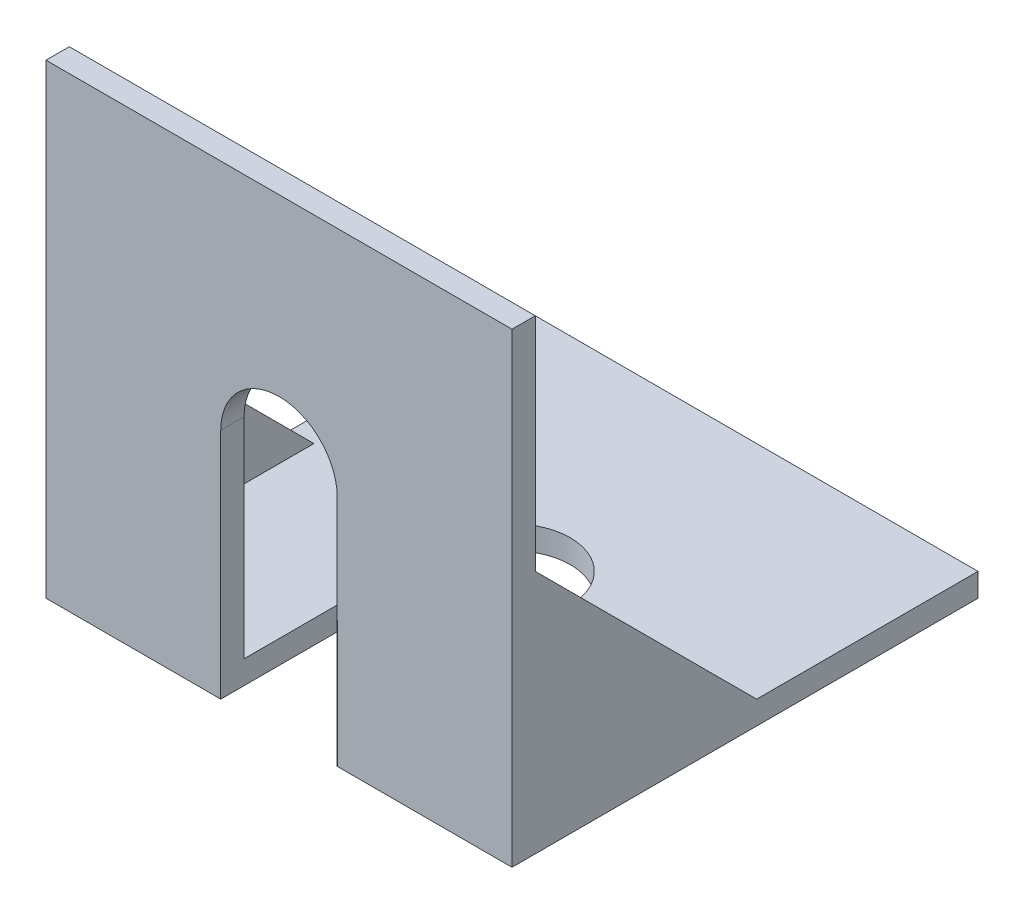
ISO-10303-21;
HEADER;
FILE_DESCRIPTION(('STEP AP214'),'2;1');
FILE_NAME('part.step','',(''),(''),'','','');
FILE_SCHEMA(('AUTOMOTIVE_DESIGN { 1 0 10303 214 1 1 1 1 }'));
ENDSEC;
DATA;
#1=APPLICATION_CONTEXT('core data for automotive mechanical design processes');
#2=APPLICATION_PROTOCOL_DEFINITION('international standard','automotive_design',2000,#1);
#3=PRODUCT_CONTEXT('',#1,'mechanical');
#4=PRODUCT('Part','Part','',(#3));
#5=PRODUCT_RELATED_PRODUCT_CATEGORY('part','',(#4));
#6=PRODUCT_DEFINITION_FORMATION('','',#4);
#7=PRODUCT_DEFINITION_CONTEXT('part definition',#1,'design');
#8=PRODUCT_DEFINITION('design','',#6,#7);
#9=PRODUCT_DEFINITION_SHAPE('','',#8);
#10=(LENGTH_UNIT() NAMED_UNIT(*) SI_UNIT(.MILLI.,.METRE.));
#11=(NAMED_UNIT(*) PLANE_ANGLE_UNIT() SI_UNIT($,.RADIAN.));
#12=(NAMED_UNIT(*) SI_UNIT($,.STERADIAN.) SOLID_ANGLE_UNIT());
#13=UNCERTAINTY_MEASURE_WITH_UNIT(LENGTH_MEASURE(1.E-05),#10,'distance_accuracy_value','');
#14=(GEOMETRIC_REPRESENTATION_CONTEXT(3) GLOBAL_UNCERTAINTY_ASSIGNED_CONTEXT((#13)) GLOBAL_UNIT_ASSIGNED_CONTEXT((#10,
#11,#12)) REPRESENTATION_CONTEXT('',''));
#15=CARTESIAN_POINT('',(0.,0.,0.));
#16=DIRECTION('',(0.,0.,1.));
#17=DIRECTION('',(1.,0.,0.));
#18=AXIS2_PLACEMENT_3D('',#15,#16,#17);
#19=CARTESIAN_POINT('',(0.,1.,0.));
#20=DIRECTION('',(0.,-1.,0.));
#21=DIRECTION('',(0.,0.,-1.));
#22=AXIS2_PLACEMENT_3D('',#19,#20,#21);
#23=PLANE('',#22);
#24=DIRECTION('',(1.,0.,0.));
#25=VECTOR('',#24,1.);
#26=CARTESIAN_POINT('',(0.,1.,9.));
#27=LINE('',#26,#25);
#28=CARTESIAN_POINT('',(-9.,1.,9.));
#29=VERTEX_POINT('',#28);
#30=CARTESIAN_POINT('',(-2.5,0.999999999999999,9.));
#31=VERTEX_POINT('',#30);
#32=EDGE_CURVE('E197',#29,#31,#27,.T.);
#33=ORIENTED_EDGE('',*,*,#32,.T.);
#34=DIRECTION('',(0.,0.,1.));
#35=VECTOR('',#34,1.);
#36=CARTESIAN_POINT('',(-2.5,1.,0.));
#37=LINE('',#36,#35);
#38=CARTESIAN_POINT('',(-2.5,1.,0.));
#39=VERTEX_POINT('',#38);
#40=EDGE_CURVE('E302',#39,#31,#37,.T.);
#41=ORIENTED_EDGE('',*,*,#40,.F.);
#42=CARTESIAN_POINT('',(0.,1.,0.));
#43=DIRECTION('',(0.,1.,0.));
#44=DIRECTION('',(0.,0.,1.));
#45=AXIS2_PLACEMENT_3D('',#42,#43,#44);
#46=CIRCLE('',#45,2.5);
#47=CARTESIAN_POINT('',(2.5,1.,0.));
#48=VERTEX_POINT('',#47);
#49=EDGE_CURVE('E201',#48,#39,#46,.T.);
#50=ORIENTED_EDGE('',*,*,#49,.F.);
#51=DIRECTION('',(0.,0.,-1.));
#52=VECTOR('',#51,1.);
#53=CARTESIAN_POINT('',(2.5,1.,9.));
#54=LINE('',#53,#52);
#55=CARTESIAN_POINT('',(2.5,1.,9.));
#56=VERTEX_POINT('',#55);
#57=EDGE_CURVE('E300',#56,#48,#54,.T.);
#58=ORIENTED_EDGE('',*,*,#57,.F.);
#59=CARTESIAN_POINT('',(9.00000000000001,1.,9.));
#60=VERTEX_POINT('',#59);
#61=EDGE_CURVE('E194',#56,#60,#27,.T.);
#62=ORIENTED_EDGE('',*,*,#61,.T.);
#63=DIRECTION('',(0.,0.,-1.));
#64=VECTOR('',#63,1.);
#65=CARTESIAN_POINT('',(9.00000000000001,1.,-0.499999999999999));
#66=LINE('',#65,#64);
#67=CARTESIAN_POINT('',(9.00000000000001,1.,-0.499999999999999));
#68=VERTEX_POINT('',#67);
#69=EDGE_CURVE('E270',#60,#68,#66,.T.);
#70=ORIENTED_EDGE('',*,*,#69,.T.);
#71=DIRECTION('',(1.,0.,0.));
#72=VECTOR('',#71,1.);
#73=CARTESIAN_POINT('',(9.00000000000001,1.,-0.499999999999999));
#74=LINE('',#73,#72);
#75=CARTESIAN_POINT('',(10.,1.,-0.5));
#76=VERTEX_POINT('',#75);
#77=EDGE_CURVE('E176',#68,#76,#74,.T.);
#78=ORIENTED_EDGE('',*,*,#77,.T.);
#79=DIRECTION('',(0.,0.,-1.));
#80=VECTOR('',#79,1.);
#81=CARTESIAN_POINT('',(10.,1.,-10.));
#82=LINE('',#81,#80);
#83=CARTESIAN_POINT('',(10.,1.,-10.));
#84=VERTEX_POINT('',#83);
#85=EDGE_CURVE('E208',#76,#84,#82,.T.);
#86=ORIENTED_EDGE('',*,*,#85,.T.);
#87=DIRECTION('',(-1.,0.,0.));
#88=VECTOR('',#87,1.);
#89=CARTESIAN_POINT('',(10.,1.,-10.));
#90=LINE('',#89,#88);
#91=CARTESIAN_POINT('',(-10.,1.,-10.));
#92=VERTEX_POINT('',#91);
#93=EDGE_CURVE('E211',#84,#92,#90,.T.);
#94=ORIENTED_EDGE('',*,*,#93,.T.);
#95=DIRECTION('',(0.,0.,1.));
#96=VECTOR('',#95,1.);
#97=CARTESIAN_POINT('',(-10.,1.,-10.));
#98=LINE('',#97,#96);
#99=CARTESIAN_POINT('',(-10.,1.,-0.499999999999999));
#100=VERTEX_POINT('',#99);
#101=EDGE_CURVE('E53',#92,#100,#98,.T.);
#102=ORIENTED_EDGE('',*,*,#101,.T.);
#103=DIRECTION('',(1.,0.,0.));
#104=VECTOR('',#103,1.);
#105=CARTESIAN_POINT('',(-9.99999999999999,1.,-0.499999999999998));
#106=LINE('',#105,#104);
#107=CARTESIAN_POINT('',(-9.,1.,-0.499999999999998));
#108=VERTEX_POINT('',#107);
#109=EDGE_CURVE('E48',#100,#108,#106,.T.);
#110=ORIENTED_EDGE('',*,*,#109,.T.);
#111=DIRECTION('',(0.,0.,-1.));
#112=VECTOR('',#111,1.);
#113=CARTESIAN_POINT('',(-9.,1.,-0.499999999999998));
#114=LINE('',#113,#112);
#115=EDGE_CURVE('E254',#29,#108,#114,.T.);
#116=ORIENTED_EDGE('',*,*,#115,.F.);
#117=EDGE_LOOP('',(#33,#41,#50,#58,#62,#70,#78,#86,#94,#102,#110,#116));
#118=FACE_BOUND('',#117,.T.);
#119=ADVANCED_FACE('F33',(#118),#23,.F.);
#120=CARTESIAN_POINT('',(0.,0.,0.));
#121=DIRECTION('',(0.,-1.,0.));
#122=DIRECTION('',(0.,0.,-1.));
#123=AXIS2_PLACEMENT_3D('',#120,#121,#122);
#124=PLANE('',#123);
#125=DIRECTION('',(0.,0.,1.));
#126=VECTOR('',#125,1.);
#127=CARTESIAN_POINT('',(-2.5,0.,0.));
#128=LINE('',#127,#126);
#129=CARTESIAN_POINT('',(-2.5,0.,0.));
#130=VERTEX_POINT('',#129);
#131=CARTESIAN_POINT('',(-2.5,0.,10.));
#132=VERTEX_POINT('',#131);
#133=EDGE_CURVE('E288',#130,#132,#128,.T.);
#134=ORIENTED_EDGE('',*,*,#133,.T.);
#135=DIRECTION('',(1.,0.,0.));
#136=VECTOR('',#135,1.);
#137=CARTESIAN_POINT('',(10.,0.,10.));
#138=LINE('',#137,#136);
#139=CARTESIAN_POINT('',(-9.99999999999999,0.,10.));
#140=VERTEX_POINT('',#139);
#141=EDGE_CURVE('E216',#140,#132,#138,.T.);
#142=ORIENTED_EDGE('',*,*,#141,.F.);
#143=DIRECTION('',(0.,0.,1.));
#144=VECTOR('',#143,1.);
#145=CARTESIAN_POINT('',(-10.,0.,-10.));
#146=LINE('',#145,#144);
#147=CARTESIAN_POINT('',(-10.,0.,-10.));
#148=VERTEX_POINT('',#147);
#149=EDGE_CURVE('E204',#148,#140,#146,.T.);
#150=ORIENTED_EDGE('',*,*,#149,.F.);
#151=DIRECTION('',(-1.,0.,0.));
#152=VECTOR('',#151,1.);
#153=CARTESIAN_POINT('',(10.,0.,-10.));
#154=LINE('',#153,#152);
#155=CARTESIAN_POINT('',(10.,0.,-10.));
#156=VERTEX_POINT('',#155);
#157=EDGE_CURVE('E209',#156,#148,#154,.T.);
#158=ORIENTED_EDGE('',*,*,#157,.F.);
#159=DIRECTION('',(0.,0.,-1.));
#160=VECTOR('',#159,1.);
#161=CARTESIAN_POINT('',(10.,0.,-10.));
#162=LINE('',#161,#160);
#163=CARTESIAN_POINT('',(10.,0.,10.));
#164=VERTEX_POINT('',#163);
#165=EDGE_CURVE('E218',#164,#156,#162,.T.);
#166=ORIENTED_EDGE('',*,*,#165,.F.);
#167=CARTESIAN_POINT('',(2.5,0.,10.));
#168=VERTEX_POINT('',#167);
#169=EDGE_CURVE('E215',#168,#164,#138,.T.);
#170=ORIENTED_EDGE('',*,*,#169,.F.);
#171=DIRECTION('',(0.,0.,-1.));
#172=VECTOR('',#171,1.);
#173=CARTESIAN_POINT('',(2.5,0.,9.));
#174=LINE('',#173,#172);
#175=CARTESIAN_POINT('',(2.5,0.,0.));
#176=VERTEX_POINT('',#175);
#177=EDGE_CURVE('E150',#168,#176,#174,.T.);
#178=ORIENTED_EDGE('',*,*,#177,.T.);
#179=CARTESIAN_POINT('',(0.,0.,0.));
#180=DIRECTION('',(0.,1.,0.));
#181=DIRECTION('',(0.,0.,1.));
#182=AXIS2_PLACEMENT_3D('',#179,#180,#181);
#183=CIRCLE('',#182,2.5);
#184=EDGE_CURVE('E200',#176,#130,#183,.T.);
#185=ORIENTED_EDGE('',*,*,#184,.T.);
#186=EDGE_LOOP('',(#134,#142,#150,#158,#166,#170,#178,#185));
#187=FACE_BOUND('',#186,.T.);
#188=ADVANCED_FACE('F235',(#187),#124,.T.);
#189=CARTESIAN_POINT('',(-10.,1.,-10.));
#190=DIRECTION('',(1.,0.,0.));
#191=DIRECTION('',(0.,0.,-1.));
#192=AXIS2_PLACEMENT_3D('',#189,#190,#191);
#193=PLANE('',#192);
#194=DIRECTION('',(0.,0.707106781186547,0.707106781186548));
#195=VECTOR('',#194,1.);
#196=CARTESIAN_POINT('',(-9.99999999999999,10.5,9.));
#197=LINE('',#196,#195);
#198=CARTESIAN_POINT('',(-9.99999999999999,10.5,9.));
#199=VERTEX_POINT('',#198);
#200=EDGE_CURVE('E245',#100,#199,#197,.T.);
#201=ORIENTED_EDGE('',*,*,#200,.F.);
#202=ORIENTED_EDGE('',*,*,#101,.F.);
#203=DIRECTION('',(0.,-1.,0.));
#204=VECTOR('',#203,1.);
#205=CARTESIAN_POINT('',(-10.,1.,-10.));
#206=LINE('',#205,#204);
#207=EDGE_CURVE('E213',#92,#148,#206,.T.);
#208=ORIENTED_EDGE('',*,*,#207,.T.);
#209=ORIENTED_EDGE('',*,*,#149,.T.);
#210=DIRECTION('',(0.,-1.,0.));
#211=VECTOR('',#210,1.);
#212=CARTESIAN_POINT('',(-9.99999999999999,1.,10.));
#213=LINE('',#212,#211);
#214=CARTESIAN_POINT('',(-9.99999999999999,20.,10.));
#215=VERTEX_POINT('',#214);
#216=EDGE_CURVE('E11',#215,#140,#213,.T.);
#217=ORIENTED_EDGE('',*,*,#216,.F.);
#218=DIRECTION('',(0.,0.,1.));
#219=VECTOR('',#218,1.);
#220=CARTESIAN_POINT('',(-9.99999999999999,20.,9.));
#221=LINE('',#220,#219);
#222=CARTESIAN_POINT('',(-9.99999999999999,20.,9.));
#223=VERTEX_POINT('',#222);
#224=EDGE_CURVE('E191',#223,#215,#221,.T.);
#225=ORIENTED_EDGE('',*,*,#224,.F.);
#226=DIRECTION('',(0.,-1.,0.));
#227=VECTOR('',#226,1.);
#228=CARTESIAN_POINT('',(-9.99999999999999,0.,9.));
#229=LINE('',#228,#227);
#230=EDGE_CURVE('E180',#223,#199,#229,.T.);
#231=ORIENTED_EDGE('',*,*,#230,.T.);
#232=EDGE_LOOP('',(#201,#202,#208,#209,#217,#225,#231));
#233=FACE_BOUND('',#232,.T.);
#234=ADVANCED_FACE('F35',(#233),#193,.F.);
#235=CARTESIAN_POINT('',(10.,1.,10.));
#236=DIRECTION('',(0.,0.,-1.));
#237=DIRECTION('',(-1.,0.,0.));
#238=AXIS2_PLACEMENT_3D('',#235,#236,#237);
#239=PLANE('',#238);
#240=ORIENTED_EDGE('',*,*,#141,.T.);
#241=DIRECTION('',(0.,1.,0.));
#242=VECTOR('',#241,1.);
#243=CARTESIAN_POINT('',(-2.5,10.,10.));
#244=LINE('',#243,#242);
#245=CARTESIAN_POINT('',(-2.5,10.,10.));
#246=VERTEX_POINT('',#245);
#247=EDGE_CURVE('E154',#132,#246,#244,.T.);
#248=ORIENTED_EDGE('',*,*,#247,.T.);
#249=CARTESIAN_POINT('',(0.,10.,10.));
#250=DIRECTION('',(0.,0.,1.));
#251=DIRECTION('',(1.,0.,0.));
#252=AXIS2_PLACEMENT_3D('',#249,#250,#251);
#253=CIRCLE('',#252,2.5);
#254=CARTESIAN_POINT('',(2.5,10.,10.));
#255=VERTEX_POINT('',#254);
#256=EDGE_CURVE('E162',#255,#246,#253,.T.);
#257=ORIENTED_EDGE('',*,*,#256,.F.);
#258=DIRECTION('',(0.,-1.,0.));
#259=VECTOR('',#258,1.);
#260=CARTESIAN_POINT('',(2.5,10.,10.));
#261=LINE('',#260,#259);
#262=EDGE_CURVE('E144',#255,#168,#261,.T.);
#263=ORIENTED_EDGE('',*,*,#262,.T.);
#264=ORIENTED_EDGE('',*,*,#169,.T.);
#265=DIRECTION('',(0.,-1.,0.));
#266=VECTOR('',#265,1.);
#267=CARTESIAN_POINT('',(10.,1.,10.));
#268=LINE('',#267,#266);
#269=CARTESIAN_POINT('',(10.,20.,10.));
#270=VERTEX_POINT('',#269);
#271=EDGE_CURVE('E41',#270,#164,#268,.T.);
#272=ORIENTED_EDGE('',*,*,#271,.F.);
#273=DIRECTION('',(-1.,0.,0.));
#274=VECTOR('',#273,1.);
#275=CARTESIAN_POINT('',(-9.99999999999999,20.,10.));
#276=LINE('',#275,#274);
#277=EDGE_CURVE('E173',#270,#215,#276,.T.);
#278=ORIENTED_EDGE('',*,*,#277,.T.);
#279=ORIENTED_EDGE('',*,*,#216,.T.);
#280=EDGE_LOOP('',(#240,#248,#257,#263,#264,#272,#278,#279));
#281=FACE_BOUND('',#280,.T.);
#282=ADVANCED_FACE('F169',(#281),#239,.F.);
#283=CARTESIAN_POINT('',(10.,1.,-10.));
#284=DIRECTION('',(-1.,0.,0.));
#285=DIRECTION('',(0.,0.,1.));
#286=AXIS2_PLACEMENT_3D('',#283,#284,#285);
#287=PLANE('',#286);
#288=ORIENTED_EDGE('',*,*,#85,.F.);
#289=DIRECTION('',(0.,0.707106781186547,0.707106781186548));
#290=VECTOR('',#289,1.);
#291=CARTESIAN_POINT('',(10.,10.5,9.));
#292=LINE('',#291,#290);
#293=CARTESIAN_POINT('',(10.,10.5,9.));
#294=VERTEX_POINT('',#293);
#295=EDGE_CURVE('E265',#76,#294,#292,.T.);
#296=ORIENTED_EDGE('',*,*,#295,.T.);
#297=DIRECTION('',(0.,1.,0.));
#298=VECTOR('',#297,1.);
#299=CARTESIAN_POINT('',(10.,0.,9.));
#300=LINE('',#299,#298);
#301=CARTESIAN_POINT('',(10.,20.,9.));
#302=VERTEX_POINT('',#301);
#303=EDGE_CURVE('E183',#294,#302,#300,.T.);
#304=ORIENTED_EDGE('',*,*,#303,.T.);
#305=DIRECTION('',(0.,0.,1.));
#306=VECTOR('',#305,1.);
#307=CARTESIAN_POINT('',(10.,20.,9.));
#308=LINE('',#307,#306);
#309=EDGE_CURVE('E188',#302,#270,#308,.T.);
#310=ORIENTED_EDGE('',*,*,#309,.T.);
#311=ORIENTED_EDGE('',*,*,#271,.T.);
#312=ORIENTED_EDGE('',*,*,#165,.T.);
#313=DIRECTION('',(0.,-1.,0.));
#314=VECTOR('',#313,1.);
#315=CARTESIAN_POINT('',(10.,1.,-10.));
#316=LINE('',#315,#314);
#317=EDGE_CURVE('E223',#84,#156,#316,.T.);
#318=ORIENTED_EDGE('',*,*,#317,.F.);
#319=EDGE_LOOP('',(#288,#296,#304,#310,#311,#312,#318));
#320=FACE_BOUND('',#319,.T.);
#321=ADVANCED_FACE('F229',(#320),#287,.F.);
#322=CARTESIAN_POINT('',(10.,1.,-10.));
#323=DIRECTION('',(0.,0.,1.));
#324=DIRECTION('',(1.,0.,0.));
#325=AXIS2_PLACEMENT_3D('',#322,#323,#324);
#326=PLANE('',#325);
#327=ORIENTED_EDGE('',*,*,#157,.T.);
#328=ORIENTED_EDGE('',*,*,#207,.F.);
#329=ORIENTED_EDGE('',*,*,#93,.F.);
#330=ORIENTED_EDGE('',*,*,#317,.T.);
#331=EDGE_LOOP('',(#327,#328,#329,#330));
#332=FACE_BOUND('',#331,.T.);
#333=ADVANCED_FACE('F240',(#332),#326,.F.);
#334=CARTESIAN_POINT('',(0.,1.,0.));
#335=DIRECTION('',(0.,-1.,0.));
#336=DIRECTION('',(0.,0.,-1.));
#337=AXIS2_PLACEMENT_3D('',#334,#335,#336);
#338=CYLINDRICAL_SURFACE('',#337,2.5);
#339=DIRECTION('',(0.,1.,0.));
#340=VECTOR('',#339,1.);
#341=CARTESIAN_POINT('',(-2.5,0.,0.));
#342=LINE('',#341,#340);
#343=EDGE_CURVE('E263',#130,#39,#342,.T.);
#344=ORIENTED_EDGE('',*,*,#343,.F.);
#345=ORIENTED_EDGE('',*,*,#184,.F.);
#346=DIRECTION('',(0.,1.,0.));
#347=VECTOR('',#346,1.);
#348=CARTESIAN_POINT('',(2.5,0.,0.));
#349=LINE('',#348,#347);
#350=EDGE_CURVE('E258',#176,#48,#349,.T.);
#351=ORIENTED_EDGE('',*,*,#350,.T.);
#352=ORIENTED_EDGE('',*,*,#49,.T.);
#353=EDGE_LOOP('',(#344,#345,#351,#352));
#354=FACE_BOUND('',#353,.T.);
#355=ADVANCED_FACE('F309',(#354),#338,.F.);
#356=CARTESIAN_POINT('',(0.,0.,9.));
#357=DIRECTION('',(0.,0.,-1.));
#358=DIRECTION('',(-1.,0.,0.));
#359=AXIS2_PLACEMENT_3D('',#356,#357,#358);
#360=PLANE('',#359);
#361=DIRECTION('',(0.,1.,0.));
#362=VECTOR('',#361,1.);
#363=CARTESIAN_POINT('',(-2.5,10.,9.));
#364=LINE('',#363,#362);
#365=CARTESIAN_POINT('',(-2.5,10.,9.));
#366=VERTEX_POINT('',#365);
#367=EDGE_CURVE('E155',#31,#366,#364,.T.);
#368=ORIENTED_EDGE('',*,*,#367,.F.);
#369=ORIENTED_EDGE('',*,*,#32,.F.);
#370=DIRECTION('',(0.,-1.,0.));
#371=VECTOR('',#370,1.);
#372=CARTESIAN_POINT('',(-9.,1.,9.));
#373=LINE('',#372,#371);
#374=CARTESIAN_POINT('',(-9.,10.5,9.));
#375=VERTEX_POINT('',#374);
#376=EDGE_CURVE('E260',#375,#29,#373,.T.);
#377=ORIENTED_EDGE('',*,*,#376,.F.);
#378=DIRECTION('',(1.,0.,0.));
#379=VECTOR('',#378,1.);
#380=CARTESIAN_POINT('',(-9.99999999999999,10.5,9.));
#381=LINE('',#380,#379);
#382=EDGE_CURVE('E251',#199,#375,#381,.T.);
#383=ORIENTED_EDGE('',*,*,#382,.F.);
#384=ORIENTED_EDGE('',*,*,#230,.F.);
#385=DIRECTION('',(-1.,0.,0.));
#386=VECTOR('',#385,1.);
#387=CARTESIAN_POINT('',(-9.99999999999999,20.,9.));
#388=LINE('',#387,#386);
#389=EDGE_CURVE('E185',#302,#223,#388,.T.);
#390=ORIENTED_EDGE('',*,*,#389,.F.);
#391=ORIENTED_EDGE('',*,*,#303,.F.);
#392=DIRECTION('',(1.,0.,0.));
#393=VECTOR('',#392,1.);
#394=CARTESIAN_POINT('',(9.00000000000001,10.5,9.));
#395=LINE('',#394,#393);
#396=CARTESIAN_POINT('',(9.00000000000001,10.5,9.));
#397=VERTEX_POINT('',#396);
#398=EDGE_CURVE('E171',#397,#294,#395,.T.);
#399=ORIENTED_EDGE('',*,*,#398,.F.);
#400=DIRECTION('',(0.,-1.,0.));
#401=VECTOR('',#400,1.);
#402=CARTESIAN_POINT('',(9.00000000000001,1.,9.));
#403=LINE('',#402,#401);
#404=EDGE_CURVE('E267',#397,#60,#403,.T.);
#405=ORIENTED_EDGE('',*,*,#404,.T.);
#406=ORIENTED_EDGE('',*,*,#61,.F.);
#407=DIRECTION('',(0.,-1.,0.));
#408=VECTOR('',#407,1.);
#409=CARTESIAN_POINT('',(2.5,10.,9.));
#410=LINE('',#409,#408);
#411=CARTESIAN_POINT('',(2.5,10.,9.));
#412=VERTEX_POINT('',#411);
#413=EDGE_CURVE('E297',#412,#56,#410,.T.);
#414=ORIENTED_EDGE('',*,*,#413,.F.);
#415=CARTESIAN_POINT('',(0.,10.,9.));
#416=DIRECTION('',(0.,0.,1.));
#417=DIRECTION('',(1.,0.,0.));
#418=AXIS2_PLACEMENT_3D('',#415,#416,#417);
#419=CIRCLE('',#418,2.5);
#420=EDGE_CURVE('E164',#412,#366,#419,.T.);
#421=ORIENTED_EDGE('',*,*,#420,.T.);
#422=EDGE_LOOP('',(#368,#369,#377,#383,#384,#390,#391,#399,#405,#406,#414,#421));
#423=FACE_BOUND('',#422,.T.);
#424=ADVANCED_FACE('F285',(#423),#360,.T.);
#425=CARTESIAN_POINT('',(-9.99999999999999,20.,9.));
#426=DIRECTION('',(0.,1.,0.));
#427=DIRECTION('',(0.,0.,1.));
#428=AXIS2_PLACEMENT_3D('',#425,#426,#427);
#429=PLANE('',#428);
#430=ORIENTED_EDGE('',*,*,#277,.F.);
#431=ORIENTED_EDGE('',*,*,#309,.F.);
#432=ORIENTED_EDGE('',*,*,#389,.T.);
#433=ORIENTED_EDGE('',*,*,#224,.T.);
#434=EDGE_LOOP('',(#430,#431,#432,#433));
#435=FACE_BOUND('',#434,.T.);
#436=ADVANCED_FACE('F287',(#435),#429,.T.);
#437=CARTESIAN_POINT('',(0.,10.,9.));
#438=DIRECTION('',(0.,0.,1.));
#439=DIRECTION('',(1.,0.,0.));
#440=AXIS2_PLACEMENT_3D('',#437,#438,#439);
#441=CYLINDRICAL_SURFACE('',#440,2.5);
#442=ORIENTED_EDGE('',*,*,#256,.T.);
#443=DIRECTION('',(0.,0.,-1.));
#444=VECTOR('',#443,1.);
#445=CARTESIAN_POINT('',(-2.5,10.,10.));
#446=LINE('',#445,#444);
#447=EDGE_CURVE('E165',#246,#366,#446,.T.);
#448=ORIENTED_EDGE('',*,*,#447,.T.);
#449=ORIENTED_EDGE('',*,*,#420,.F.);
#450=DIRECTION('',(0.,0.,-1.));
#451=VECTOR('',#450,1.);
#452=CARTESIAN_POINT('',(2.5,10.,10.));
#453=LINE('',#452,#451);
#454=EDGE_CURVE('E147',#255,#412,#453,.T.);
#455=ORIENTED_EDGE('',*,*,#454,.F.);
#456=EDGE_LOOP('',(#442,#448,#449,#455));
#457=FACE_BOUND('',#456,.T.);
#458=ADVANCED_FACE('F160',(#457),#441,.F.);
#459=CARTESIAN_POINT('',(9.00000000000001,10.5,9.));
#460=DIRECTION('',(0.,0.707106781186548,-0.707106781186547));
#461=DIRECTION('',(0.,0.707106781186547,0.707106781186548));
#462=AXIS2_PLACEMENT_3D('',#459,#460,#461);
#463=PLANE('',#462);
#464=ORIENTED_EDGE('',*,*,#295,.F.);
#465=ORIENTED_EDGE('',*,*,#77,.F.);
#466=DIRECTION('',(0.,0.707106781186547,0.707106781186548));
#467=VECTOR('',#466,1.);
#468=CARTESIAN_POINT('',(9.00000000000001,10.5,9.));
#469=LINE('',#468,#467);
#470=EDGE_CURVE('E273',#68,#397,#469,.T.);
#471=ORIENTED_EDGE('',*,*,#470,.T.);
#472=ORIENTED_EDGE('',*,*,#398,.T.);
#473=EDGE_LOOP('',(#464,#465,#471,#472));
#474=FACE_BOUND('',#473,.T.);
#475=ADVANCED_FACE('F282',(#474),#463,.T.);
#476=CARTESIAN_POINT('',(9.00000000000001,0.,0.));
#477=DIRECTION('',(1.,0.,0.));
#478=DIRECTION('',(0.,0.,-1.));
#479=AXIS2_PLACEMENT_3D('',#476,#477,#478);
#480=PLANE('',#479);
#481=ORIENTED_EDGE('',*,*,#404,.F.);
#482=ORIENTED_EDGE('',*,*,#470,.F.);
#483=ORIENTED_EDGE('',*,*,#69,.F.);
#484=EDGE_LOOP('',(#481,#482,#483));
#485=FACE_BOUND('',#484,.T.);
#486=ADVANCED_FACE('F313',(#485),#480,.F.);
#487=CARTESIAN_POINT('',(-9.99999999999999,10.5,9.));
#488=DIRECTION('',(0.,0.707106781186548,-0.707106781186547));
#489=DIRECTION('',(0.,0.707106781186547,0.707106781186548));
#490=AXIS2_PLACEMENT_3D('',#487,#488,#489);
#491=PLANE('',#490);
#492=DIRECTION('',(0.,0.707106781186547,0.707106781186548));
#493=VECTOR('',#492,1.);
#494=CARTESIAN_POINT('',(-9.,10.5,9.));
#495=LINE('',#494,#493);
#496=EDGE_CURVE('E249',#108,#375,#495,.T.);
#497=ORIENTED_EDGE('',*,*,#496,.F.);
#498=ORIENTED_EDGE('',*,*,#109,.F.);
#499=ORIENTED_EDGE('',*,*,#200,.T.);
#500=ORIENTED_EDGE('',*,*,#382,.T.);
#501=EDGE_LOOP('',(#497,#498,#499,#500));
#502=FACE_BOUND('',#501,.T.);
#503=ADVANCED_FACE('F315',(#502),#491,.T.);
#504=CARTESIAN_POINT('',(-9.,0.,0.));
#505=DIRECTION('',(1.,0.,0.));
#506=DIRECTION('',(0.,0.,-1.));
#507=AXIS2_PLACEMENT_3D('',#504,#505,#506);
#508=PLANE('',#507);
#509=ORIENTED_EDGE('',*,*,#376,.T.);
#510=ORIENTED_EDGE('',*,*,#115,.T.);
#511=ORIENTED_EDGE('',*,*,#496,.T.);
#512=EDGE_LOOP('',(#509,#510,#511));
#513=FACE_BOUND('',#512,.T.);
#514=ADVANCED_FACE('F321',(#513),#508,.T.);
#515=CARTESIAN_POINT('',(-2.5,0.,0.));
#516=DIRECTION('',(-1.,0.,0.));
#517=DIRECTION('',(0.,0.,1.));
#518=AXIS2_PLACEMENT_3D('',#515,#516,#517);
#519=PLANE('',#518);
#520=ORIENTED_EDGE('',*,*,#40,.T.);
#521=ORIENTED_EDGE('',*,*,#367,.T.);
#522=ORIENTED_EDGE('',*,*,#447,.F.);
#523=ORIENTED_EDGE('',*,*,#247,.F.);
#524=ORIENTED_EDGE('',*,*,#133,.F.);
#525=ORIENTED_EDGE('',*,*,#343,.T.);
#526=EDGE_LOOP('',(#520,#521,#522,#523,#524,#525));
#527=FACE_BOUND('',#526,.T.);
#528=ADVANCED_FACE('F294',(#527),#519,.F.);
#529=CARTESIAN_POINT('',(2.5,0.,9.));
#530=DIRECTION('',(1.,0.,0.));
#531=DIRECTION('',(0.,0.,-1.));
#532=AXIS2_PLACEMENT_3D('',#529,#530,#531);
#533=PLANE('',#532);
#534=ORIENTED_EDGE('',*,*,#57,.T.);
#535=ORIENTED_EDGE('',*,*,#350,.F.);
#536=ORIENTED_EDGE('',*,*,#177,.F.);
#537=ORIENTED_EDGE('',*,*,#262,.F.);
#538=ORIENTED_EDGE('',*,*,#454,.T.);
#539=ORIENTED_EDGE('',*,*,#413,.T.);
#540=EDGE_LOOP('',(#534,#535,#536,#537,#538,#539));
#541=FACE_BOUND('',#540,.T.);
#542=ADVANCED_FACE('F146',(#541),#533,.F.);
#543=CLOSED_SHELL('',(#119,#188,#234,#282,#321,#333,#355,#424,#436,#458,#475,#486,#503,#514,
#528,#542));
#544=MANIFOLD_SOLID_BREP('B2',#543);
#545=ADVANCED_BREP_SHAPE_REPRESENTATION('',(#18,#544),#14);
#546=SHAPE_DEFINITION_REPRESENTATION(#9,#545);
ENDSEC;
END-ISO-10303-21;
